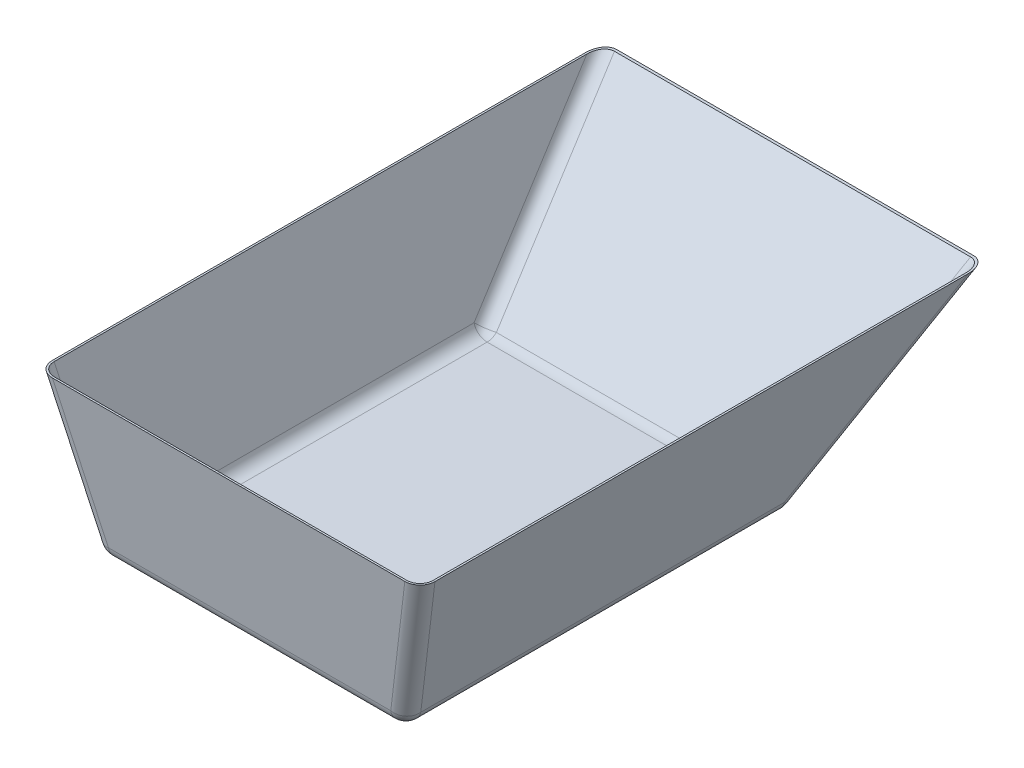
ISO-10303-21;
HEADER;
FILE_DESCRIPTION(('STEP AP214'),'2;1');
FILE_NAME('part.step','',(''),(''),'','','');
FILE_SCHEMA(('AUTOMOTIVE_DESIGN { 1 0 10303 214 1 1 1 1 }'));
ENDSEC;
DATA;
#1=APPLICATION_CONTEXT('core data for automotive mechanical design processes');
#2=APPLICATION_PROTOCOL_DEFINITION('international standard','automotive_design',2000,#1);
#3=PRODUCT_CONTEXT('',#1,'mechanical');
#4=PRODUCT('Part','Part','',(#3));
#5=PRODUCT_RELATED_PRODUCT_CATEGORY('part','',(#4));
#6=PRODUCT_DEFINITION_FORMATION('','',#4);
#7=PRODUCT_DEFINITION_CONTEXT('part definition',#1,'design');
#8=PRODUCT_DEFINITION('design','',#6,#7);
#9=PRODUCT_DEFINITION_SHAPE('','',#8);
#10=(LENGTH_UNIT() NAMED_UNIT(*) SI_UNIT(.MILLI.,.METRE.));
#11=(NAMED_UNIT(*) PLANE_ANGLE_UNIT() SI_UNIT($,.RADIAN.));
#12=(NAMED_UNIT(*) SI_UNIT($,.STERADIAN.) SOLID_ANGLE_UNIT());
#13=UNCERTAINTY_MEASURE_WITH_UNIT(LENGTH_MEASURE(1.E-05),#10,'distance_accuracy_value','');
#14=(GEOMETRIC_REPRESENTATION_CONTEXT(3) GLOBAL_UNCERTAINTY_ASSIGNED_CONTEXT((#13)) GLOBAL_UNIT_ASSIGNED_CONTEXT((#10,
#11,#12)) REPRESENTATION_CONTEXT('',''));
#15=CARTESIAN_POINT('',(0.,0.,0.));
#16=DIRECTION('',(0.,0.,1.));
#17=DIRECTION('',(1.,0.,0.));
#18=AXIS2_PLACEMENT_3D('',#15,#16,#17);
#19=CARTESIAN_POINT('',(-125.,50.,370.));
#20=DIRECTION('',(0.,-1.,0.));
#21=DIRECTION('',(0.,0.,-1.));
#22=AXIS2_PLACEMENT_3D('',#19,#20,#21);
#23=PLANE('',#22);
#24=DIRECTION('',(0.,0.,-1.));
#25=VECTOR('',#24,1.);
#26=CARTESIAN_POINT('',(125.,50.,370.));
#27=LINE('',#26,#25);
#28=CARTESIAN_POINT('',(125.,50.,360.251929229476));
#29=VERTEX_POINT('',#28);
#30=CARTESIAN_POINT('',(125.,50.,11.9533759371185));
#31=VERTEX_POINT('',#30);
#32=EDGE_CURVE('E244',#29,#31,#27,.T.);
#33=ORIENTED_EDGE('',*,*,#32,.T.);
#34=CARTESIAN_POINT('',(114.692235935956,50.,14.5));
#35=DIRECTION('',(0.,-1.,0.));
#36=DIRECTION('',(0.23162052730604,0.,-0.972806214685367));
#37=AXIS2_PLACEMENT_3D('',#34,#35,#36);
#38=ELLIPSE('',#37,14.7139389695622,10.);
#39=CARTESIAN_POINT('',(116.502580763542,50.,0.));
#40=VERTEX_POINT('',#39);
#41=EDGE_CURVE('E11',#31,#40,#38,.F.);
#42=ORIENTED_EDGE('',*,*,#41,.T.);
#43=DIRECTION('',(-1.,0.,0.));
#44=VECTOR('',#43,1.);
#45=CARTESIAN_POINT('',(-125.,50.,0.));
#46=LINE('',#45,#44);
#47=CARTESIAN_POINT('',(-116.502580763542,50.,0.));
#48=VERTEX_POINT('',#47);
#49=EDGE_CURVE('E239',#40,#48,#46,.T.);
#50=ORIENTED_EDGE('',*,*,#49,.T.);
#51=CARTESIAN_POINT('',(-114.692235935956,50.,14.5));
#52=DIRECTION('',(0.,-1.,0.));
#53=DIRECTION('',(0.23162052730604,0.,0.972806214685367));
#54=AXIS2_PLACEMENT_3D('',#51,#52,#53);
#55=ELLIPSE('',#54,14.7139389695622,10.);
#56=CARTESIAN_POINT('',(-125.,50.,11.9533759371185));
#57=VERTEX_POINT('',#56);
#58=EDGE_CURVE('E43',#48,#57,#55,.F.);
#59=ORIENTED_EDGE('',*,*,#58,.T.);
#60=DIRECTION('',(0.,0.,-1.));
#61=VECTOR('',#60,1.);
#62=CARTESIAN_POINT('',(-125.,50.,370.));
#63=LINE('',#62,#61);
#64=CARTESIAN_POINT('',(-125.,50.,360.251929229476));
#65=VERTEX_POINT('',#64);
#66=EDGE_CURVE('E238',#65,#57,#63,.T.);
#67=ORIENTED_EDGE('',*,*,#66,.F.);
#68=CARTESIAN_POINT('',(-114.692235935956,50.,359.888125791922));
#69=DIRECTION('',(0.,-1.,0.));
#70=DIRECTION('',(-0.857492925712544,0.,0.514495755427527));
#71=AXIS2_PLACEMENT_3D('',#68,#69,#70);
#72=ELLIPSE('',#71,10.4163333279998,10.);
#73=CARTESIAN_POINT('',(-115.063087068281,50.,370.));
#74=VERTEX_POINT('',#73);
#75=EDGE_CURVE('E282',#65,#74,#72,.F.);
#76=ORIENTED_EDGE('',*,*,#75,.T.);
#77=DIRECTION('',(-1.,0.,0.));
#78=VECTOR('',#77,1.);
#79=CARTESIAN_POINT('',(-125.,50.,370.));
#80=LINE('',#79,#78);
#81=CARTESIAN_POINT('',(115.063087068281,50.,370.));
#82=VERTEX_POINT('',#81);
#83=EDGE_CURVE('E235',#82,#74,#80,.T.);
#84=ORIENTED_EDGE('',*,*,#83,.F.);
#85=CARTESIAN_POINT('',(114.692235935956,50.,359.888125791922));
#86=DIRECTION('',(0.,-1.,0.));
#87=DIRECTION('',(-0.857492925712544,0.,-0.514495755427527));
#88=AXIS2_PLACEMENT_3D('',#85,#86,#87);
#89=ELLIPSE('',#88,10.4163333279998,10.);
#90=EDGE_CURVE('E280',#82,#29,#89,.F.);
#91=ORIENTED_EDGE('',*,*,#90,.T.);
#92=EDGE_LOOP('',(#33,#42,#50,#59,#67,#76,#84,#91));
#93=FACE_BOUND('',#92,.T.);
#94=DIRECTION('',(0.,0.,-1.));
#95=VECTOR('',#94,1.);
#96=CARTESIAN_POINT('',(123.763068312315,50.,370.));
#97=LINE('',#96,#95);
#98=CARTESIAN_POINT('',(123.763068312315,50.,360.20827281697));
#99=VERTEX_POINT('',#98);
#100=CARTESIAN_POINT('',(123.763068312315,50.,12.2589708246643));
#101=VERTEX_POINT('',#100);
#102=EDGE_CURVE('E213',#99,#101,#97,.T.);
#103=ORIENTED_EDGE('',*,*,#102,.F.);
#104=CARTESIAN_POINT('',(114.692235935956,50.,359.888125791922));
#105=DIRECTION('',(0.,-1.,0.));
#106=DIRECTION('',(-0.857492925712544,0.,-0.514495755427527));
#107=AXIS2_PLACEMENT_3D('',#104,#105,#106);
#108=ELLIPSE('',#107,9.16637332863985,8.8);
#109=CARTESIAN_POINT('',(115.018584932402,50.,368.786575095031));
#110=VERTEX_POINT('',#109);
#111=EDGE_CURVE('E231',#110,#99,#108,.F.);
#112=ORIENTED_EDGE('',*,*,#111,.F.);
#113=DIRECTION('',(-1.,0.,0.));
#114=VECTOR('',#113,1.);
#115=CARTESIAN_POINT('',(125.,50.,368.786575095031));
#116=LINE('',#115,#114);
#117=CARTESIAN_POINT('',(-115.018584932402,50.,368.786575095031));
#118=VERTEX_POINT('',#117);
#119=EDGE_CURVE('E51',#110,#118,#116,.T.);
#120=ORIENTED_EDGE('',*,*,#119,.T.);
#121=CARTESIAN_POINT('',(-114.692235935956,50.,359.888125791922));
#122=DIRECTION('',(0.,-1.,0.));
#123=DIRECTION('',(-0.857492925712544,0.,0.514495755427527));
#124=AXIS2_PLACEMENT_3D('',#121,#122,#123);
#125=ELLIPSE('',#124,9.16637332863985,8.8);
#126=CARTESIAN_POINT('',(-123.763068312315,50.,360.20827281697));
#127=VERTEX_POINT('',#126);
#128=EDGE_CURVE('E227',#127,#118,#125,.F.);
#129=ORIENTED_EDGE('',*,*,#128,.F.);
#130=DIRECTION('',(0.,0.,-1.));
#131=VECTOR('',#130,1.);
#132=CARTESIAN_POINT('',(-123.763068312315,50.,0.));
#133=LINE('',#132,#131);
#134=CARTESIAN_POINT('',(-123.763068312315,50.,12.2589708246643));
#135=VERTEX_POINT('',#134);
#136=EDGE_CURVE('E217',#127,#135,#133,.T.);
#137=ORIENTED_EDGE('',*,*,#136,.T.);
#138=CARTESIAN_POINT('',(-114.692235935956,50.,14.5));
#139=DIRECTION('',(0.,-1.,0.));
#140=DIRECTION('',(0.23162052730604,0.,0.972806214685367));
#141=AXIS2_PLACEMENT_3D('',#138,#139,#140);
#142=ELLIPSE('',#141,12.9482662932147,8.8);
#143=CARTESIAN_POINT('',(-116.285339384232,50.,1.73999999999999));
#144=VERTEX_POINT('',#143);
#145=EDGE_CURVE('E221',#144,#135,#142,.F.);
#146=ORIENTED_EDGE('',*,*,#145,.F.);
#147=DIRECTION('',(-1.,0.,0.));
#148=VECTOR('',#147,1.);
#149=CARTESIAN_POINT('',(-125.,50.,1.74000000000002));
#150=LINE('',#149,#148);
#151=CARTESIAN_POINT('',(116.285339384232,50.,1.73999999999998));
#152=VERTEX_POINT('',#151);
#153=EDGE_CURVE('E222',#152,#144,#150,.T.);
#154=ORIENTED_EDGE('',*,*,#153,.F.);
#155=CARTESIAN_POINT('',(114.692235935956,50.,14.5));
#156=DIRECTION('',(0.,-1.,0.));
#157=DIRECTION('',(0.23162052730604,0.,-0.972806214685367));
#158=AXIS2_PLACEMENT_3D('',#155,#156,#157);
#159=ELLIPSE('',#158,12.9482662932147,8.8);
#160=EDGE_CURVE('E218',#101,#152,#159,.F.);
#161=ORIENTED_EDGE('',*,*,#160,.F.);
#162=EDGE_LOOP('',(#103,#112,#120,#129,#137,#146,#154,#161));
#163=FACE_BOUND('',#162,.T.);
#164=ADVANCED_FACE('F34',(#93,#163),#23,.F.);
#165=CARTESIAN_POINT('',(-125.,-50.,370.));
#166=DIRECTION('',(0.,1.,0.));
#167=DIRECTION('',(0.,0.,1.));
#168=AXIS2_PLACEMENT_3D('',#165,#166,#167);
#169=PLANE('',#168);
#170=DIRECTION('',(-1.,0.,0.));
#171=VECTOR('',#170,1.);
#172=CARTESIAN_POINT('',(-125.,-50.,346.388125791922));
#173=LINE('',#172,#171);
#174=CARTESIAN_POINT('',(92.1922359359558,-50.,346.388125791922));
#175=VERTEX_POINT('',#174);
#176=CARTESIAN_POINT('',(-92.1922359359558,-50.,346.388125791922));
#177=VERTEX_POINT('',#176);
#178=EDGE_CURVE('E258',#175,#177,#173,.T.);
#179=ORIENTED_EDGE('',*,*,#178,.T.);
#180=DIRECTION('',(0.,0.,1.));
#181=VECTOR('',#180,1.);
#182=CARTESIAN_POINT('',(-92.1922359359558,-50.,370.));
#183=LINE('',#182,#181);
#184=CARTESIAN_POINT('',(-92.1922359359558,-50.,109.));
#185=VERTEX_POINT('',#184);
#186=EDGE_CURVE('E260',#177,#185,#183,.F.);
#187=ORIENTED_EDGE('',*,*,#186,.T.);
#188=DIRECTION('',(-1.,0.,0.));
#189=VECTOR('',#188,1.);
#190=CARTESIAN_POINT('',(-125.,-50.,109.));
#191=LINE('',#190,#189);
#192=CARTESIAN_POINT('',(92.1922359359558,-50.,109.));
#193=VERTEX_POINT('',#192);
#194=EDGE_CURVE('E254',#185,#193,#191,.F.);
#195=ORIENTED_EDGE('',*,*,#194,.T.);
#196=DIRECTION('',(0.,0.,1.));
#197=VECTOR('',#196,1.);
#198=CARTESIAN_POINT('',(92.1922359359558,-50.,370.));
#199=LINE('',#198,#197);
#200=EDGE_CURVE('E256',#193,#175,#199,.T.);
#201=ORIENTED_EDGE('',*,*,#200,.T.);
#202=EDGE_LOOP('',(#179,#187,#195,#201));
#203=FACE_BOUND('',#202,.T.);
#204=ADVANCED_FACE('F366',(#203),#169,.F.);
#205=CARTESIAN_POINT('',(-125.,50.,0.));
#206=DIRECTION('',(0.970142500145332,0.242535625036333,0.));
#207=DIRECTION('',(-0.242535625036333,0.970142500145332,0.));
#208=AXIS2_PLACEMENT_3D('',#205,#206,#207);
#209=PLANE('',#208);
#210=ORIENTED_EDGE('',*,*,#66,.T.);
#211=DIRECTION('',(0.169906916507646,-0.679627666030585,0.713609049332114));
#212=VECTOR('',#211,1.);
#213=CARTESIAN_POINT('',(-126.449312324939,55.7972492997572,5.86626417237341));
#214=LINE('',#213,#212);
#215=CARTESIAN_POINT('',(-101.893660937409,-42.4253562503633,109.));
#216=VERTEX_POINT('',#215);
#217=EDGE_CURVE('E252',#57,#216,#214,.T.);
#218=ORIENTED_EDGE('',*,*,#217,.T.);
#219=DIRECTION('',(0.,0.,1.));
#220=VECTOR('',#219,1.);
#221=CARTESIAN_POINT('',(-101.893660937409,-42.4253562503633,0.));
#222=LINE('',#221,#220);
#223=CARTESIAN_POINT('',(-101.893660937409,-42.4253562503633,346.388125791922));
#224=VERTEX_POINT('',#223);
#225=EDGE_CURVE('E249',#216,#224,#222,.T.);
#226=ORIENTED_EDGE('',*,*,#225,.T.);
#227=DIRECTION('',(-0.24000768036866,0.960030721474639,0.144004608221196));
#228=VECTOR('',#227,1.);
#229=CARTESIAN_POINT('',(-112.548896455202,0.19558582080971,352.781267102598));
#230=LINE('',#229,#228);
#231=EDGE_CURVE('E247',#224,#65,#230,.T.);
#232=ORIENTED_EDGE('',*,*,#231,.T.);
#233=EDGE_LOOP('',(#210,#218,#226,#232));
#234=FACE_BOUND('',#233,.T.);
#235=ADVANCED_FACE('F339',(#234),#209,.F.);
#236=CARTESIAN_POINT('',(100.,-50.,0.));
#237=DIRECTION('',(-0.970142500145332,0.242535625036333,0.));
#238=DIRECTION('',(-0.242535625036333,-0.970142500145332,0.));
#239=AXIS2_PLACEMENT_3D('',#236,#237,#238);
#240=PLANE('',#239);
#241=DIRECTION('',(0.,0.,1.));
#242=VECTOR('',#241,1.);
#243=CARTESIAN_POINT('',(101.893660937409,-42.4253562503633,0.));
#244=LINE('',#243,#242);
#245=CARTESIAN_POINT('',(101.893660937409,-42.4253562503633,346.388125791922));
#246=VERTEX_POINT('',#245);
#247=CARTESIAN_POINT('',(101.893660937409,-42.4253562503633,109.));
#248=VERTEX_POINT('',#247);
#249=EDGE_CURVE('E271',#246,#248,#244,.F.);
#250=ORIENTED_EDGE('',*,*,#249,.T.);
#251=DIRECTION('',(0.169906916507646,0.679627666030585,-0.713609049332114));
#252=VECTOR('',#251,1.);
#253=CARTESIAN_POINT('',(114.180259207156,6.72103682862558,57.3962872670616));
#254=LINE('',#253,#252);
#255=EDGE_CURVE('E273',#248,#31,#254,.T.);
#256=ORIENTED_EDGE('',*,*,#255,.T.);
#257=ORIENTED_EDGE('',*,*,#32,.F.);
#258=DIRECTION('',(-0.24000768036866,-0.960030721474639,-0.144004608221196));
#259=VECTOR('',#258,1.);
#260=CARTESIAN_POINT('',(88.0673296349259,-97.7306814602963,338.092327010432));
#261=LINE('',#260,#259);
#262=EDGE_CURVE('E269',#29,#246,#261,.T.);
#263=ORIENTED_EDGE('',*,*,#262,.T.);
#264=EDGE_LOOP('',(#250,#256,#257,#263));
#265=FACE_BOUND('',#264,.T.);
#266=ADVANCED_FACE('F370',(#265),#240,.F.);
#267=CARTESIAN_POINT('',(125.,50.,370.));
#268=DIRECTION('',(0.,0.148340452930245,-0.988936352868298));
#269=DIRECTION('',(0.,0.988936352868298,0.148340452930245));
#270=AXIS2_PLACEMENT_3D('',#267,#268,#269);
#271=PLANE('',#270);
#272=ORIENTED_EDGE('',*,*,#83,.T.);
#273=DIRECTION('',(-0.24000768036866,0.960030721474639,0.144004608221196));
#274=VECTOR('',#273,1.);
#275=CARTESIAN_POINT('',(-101.234568227943,-5.31407536135515,361.702888695797));
#276=LINE('',#275,#274);
#277=CARTESIAN_POINT('',(-92.1922359359558,-41.4834045293024,356.277489320605));
#278=VERTEX_POINT('',#277);
#279=EDGE_CURVE('E267',#74,#278,#276,.F.);
#280=ORIENTED_EDGE('',*,*,#279,.T.);
#281=DIRECTION('',(-1.,0.,0.));
#282=VECTOR('',#281,1.);
#283=CARTESIAN_POINT('',(125.,-41.4834045293025,356.277489320605));
#284=LINE('',#283,#282);
#285=CARTESIAN_POINT('',(92.1922359359558,-41.4834045293024,356.277489320605));
#286=VERTEX_POINT('',#285);
#287=EDGE_CURVE('E265',#278,#286,#284,.F.);
#288=ORIENTED_EDGE('',*,*,#287,.T.);
#289=DIRECTION('',(-0.24000768036866,-0.960030721474639,-0.144004608221196));
#290=VECTOR('',#289,1.);
#291=CARTESIAN_POINT('',(115.635489886929,52.2896112745895,370.343441691188));
#292=LINE('',#291,#290);
#293=EDGE_CURVE('E263',#286,#82,#292,.F.);
#294=ORIENTED_EDGE('',*,*,#293,.T.);
#295=EDGE_LOOP('',(#272,#280,#288,#294));
#296=FACE_BOUND('',#295,.T.);
#297=ADVANCED_FACE('F349',(#296),#271,.F.);
#298=CARTESIAN_POINT('',(125.,50.,0.));
#299=DIRECTION('',(0.,0.724137931034483,0.689655172413793));
#300=DIRECTION('',(0.,-0.689655172413793,0.724137931034483));
#301=AXIS2_PLACEMENT_3D('',#298,#299,#300);
#302=PLANE('',#301);
#303=ORIENTED_EDGE('',*,*,#49,.F.);
#304=DIRECTION('',(0.169906916507646,0.679627666030585,-0.713609049332114));
#305=VECTOR('',#304,1.);
#306=CARTESIAN_POINT('',(116.747887323486,50.9812262397757,-1.03028755176453));
#307=LINE('',#306,#305);
#308=CARTESIAN_POINT('',(92.1922359359558,-47.2413793103448,102.103448275862));
#309=VERTEX_POINT('',#308);
#310=EDGE_CURVE('E59',#40,#309,#307,.F.);
#311=ORIENTED_EDGE('',*,*,#310,.T.);
#312=DIRECTION('',(-1.,0.,0.));
#313=VECTOR('',#312,1.);
#314=CARTESIAN_POINT('',(125.,-47.2413793103448,102.103448275862));
#315=LINE('',#314,#313);
#316=CARTESIAN_POINT('',(-92.1922359359558,-47.2413793103448,102.103448275862));
#317=VERTEX_POINT('',#316);
#318=EDGE_CURVE('E277',#309,#317,#315,.T.);
#319=ORIENTED_EDGE('',*,*,#318,.T.);
#320=DIRECTION('',(0.169906916507646,-0.679627666030585,0.713609049332114));
#321=VECTOR('',#320,1.);
#322=CARTESIAN_POINT('',(-109.530797254202,22.1128659626395,29.2814907392285));
#323=LINE('',#322,#321);
#324=EDGE_CURVE('E275',#317,#48,#323,.F.);
#325=ORIENTED_EDGE('',*,*,#324,.T.);
#326=EDGE_LOOP('',(#303,#311,#319,#325));
#327=FACE_BOUND('',#326,.T.);
#328=ADVANCED_FACE('F327',(#327),#302,.F.);
#329=CARTESIAN_POINT('',(104.478834205703,9.14639307898891,57.3962872670616));
#330=DIRECTION('',(0.169906916507646,0.679627666030585,-0.713609049332114));
#331=DIRECTION('',(0.,0.724137931034483,0.689655172413793));
#332=AXIS2_PLACEMENT_3D('',#329,#330,#331);
#333=CYLINDRICAL_SURFACE('',#332,10.);
#334=ORIENTED_EDGE('',*,*,#41,.F.);
#335=ORIENTED_EDGE('',*,*,#255,.F.);
#336=CARTESIAN_POINT('',(92.1922359359558,-40.,109.));
#337=DIRECTION('',(-0.169906916507646,-0.679627666030585,0.713609049332114));
#338=DIRECTION('',(0.,-0.724137931034483,-0.689655172413793));
#339=AXIS2_PLACEMENT_3D('',#336,#337,#338);
#340=CIRCLE('',#339,10.);
#341=EDGE_CURVE('E311',#309,#248,#340,.T.);
#342=ORIENTED_EDGE('',*,*,#341,.F.);
#343=ORIENTED_EDGE('',*,*,#310,.F.);
#344=EDGE_LOOP('',(#334,#335,#342,#343));
#345=FACE_BOUND('',#344,.T.);
#346=ADVANCED_FACE('F36',(#345),#333,.T.);
#347=CARTESIAN_POINT('',(78.3659046334726,-95.3053252099329,338.092327010432));
#348=DIRECTION('',(-0.24000768036866,-0.960030721474639,-0.144004608221196));
#349=DIRECTION('',(0.970142500145332,-0.242535625036333,0.));
#350=AXIS2_PLACEMENT_3D('',#347,#348,#349);
#351=CYLINDRICAL_SURFACE('',#350,10.);
#352=ORIENTED_EDGE('',*,*,#90,.F.);
#353=ORIENTED_EDGE('',*,*,#293,.F.);
#354=CARTESIAN_POINT('',(92.1922359359558,-40.,346.388125791922));
#355=DIRECTION('',(-0.24000768036866,-0.960030721474639,-0.144004608221196));
#356=DIRECTION('',(0.970142500145332,-0.242535625036333,0.));
#357=AXIS2_PLACEMENT_3D('',#354,#355,#356);
#358=CIRCLE('',#357,10.);
#359=EDGE_CURVE('E309',#246,#286,#358,.T.);
#360=ORIENTED_EDGE('',*,*,#359,.F.);
#361=ORIENTED_EDGE('',*,*,#262,.F.);
#362=EDGE_LOOP('',(#352,#353,#360,#361));
#363=FACE_BOUND('',#362,.T.);
#364=ADVANCED_FACE('F354',(#363),#351,.T.);
#365=CARTESIAN_POINT('',(92.1922359359558,-40.,370.));
#366=DIRECTION('',(0.,0.,1.));
#367=DIRECTION('',(1.,0.,0.));
#368=AXIS2_PLACEMENT_3D('',#365,#366,#367);
#369=CYLINDRICAL_SURFACE('',#368,10.);
#370=CARTESIAN_POINT('',(92.1922359359558,-40.,109.));
#371=DIRECTION('',(0.,0.,-1.));
#372=DIRECTION('',(0.,1.,0.));
#373=AXIS2_PLACEMENT_3D('',#370,#371,#372);
#374=CIRCLE('',#373,10.);
#375=EDGE_CURVE('E38',#248,#193,#374,.T.);
#376=ORIENTED_EDGE('',*,*,#375,.F.);
#377=ORIENTED_EDGE('',*,*,#249,.F.);
#378=CARTESIAN_POINT('',(92.1922359359558,-40.,346.388125791922));
#379=DIRECTION('',(0.,0.,1.));
#380=DIRECTION('',(1.,0.,0.));
#381=AXIS2_PLACEMENT_3D('',#378,#379,#380);
#382=CIRCLE('',#381,10.);
#383=EDGE_CURVE('E306',#175,#246,#382,.T.);
#384=ORIENTED_EDGE('',*,*,#383,.F.);
#385=ORIENTED_EDGE('',*,*,#200,.F.);
#386=EDGE_LOOP('',(#376,#377,#384,#385));
#387=FACE_BOUND('',#386,.T.);
#388=ADVANCED_FACE('F367',(#387),#369,.T.);
#389=CARTESIAN_POINT('',(92.1922359359558,-40.,109.));
#390=DIRECTION('',(0.,0.,1.));
#391=DIRECTION('',(1.,0.,0.));
#392=AXIS2_PLACEMENT_3D('',#389,#390,#391);
#393=SPHERICAL_SURFACE('',#392,10.);
#394=ORIENTED_EDGE('',*,*,#341,.T.);
#395=ORIENTED_EDGE('',*,*,#375,.T.);
#396=CARTESIAN_POINT('',(92.1922359359558,-40.,109.));
#397=DIRECTION('',(1.,0.,0.));
#398=DIRECTION('',(0.,0.,-1.));
#399=AXIS2_PLACEMENT_3D('',#396,#397,#398);
#400=CIRCLE('',#399,10.);
#401=EDGE_CURVE('E303',#309,#193,#400,.F.);
#402=ORIENTED_EDGE('',*,*,#401,.F.);
#403=EDGE_LOOP('',(#394,#395,#402));
#404=FACE_BOUND('',#403,.T.);
#405=ADVANCED_FACE('F317',(#404),#393,.T.);
#406=CARTESIAN_POINT('',(92.1922359359558,-40.,346.388125791922));
#407=DIRECTION('',(0.,0.,1.));
#408=DIRECTION('',(1.,0.,0.));
#409=AXIS2_PLACEMENT_3D('',#406,#407,#408);
#410=SPHERICAL_SURFACE('',#409,10.);
#411=ORIENTED_EDGE('',*,*,#383,.T.);
#412=ORIENTED_EDGE('',*,*,#359,.T.);
#413=CARTESIAN_POINT('',(92.1922359359558,-40.,346.388125791922));
#414=DIRECTION('',(1.,0.,0.));
#415=DIRECTION('',(0.,0.,-1.));
#416=AXIS2_PLACEMENT_3D('',#413,#414,#415);
#417=CIRCLE('',#416,10.);
#418=EDGE_CURVE('E300',#175,#286,#417,.F.);
#419=ORIENTED_EDGE('',*,*,#418,.F.);
#420=EDGE_LOOP('',(#411,#412,#419));
#421=FACE_BOUND('',#420,.T.);
#422=ADVANCED_FACE('F358',(#421),#410,.T.);
#423=CARTESIAN_POINT('',(125.,-40.,109.));
#424=DIRECTION('',(-1.,0.,0.));
#425=DIRECTION('',(0.,0.,1.));
#426=AXIS2_PLACEMENT_3D('',#423,#424,#425);
#427=CYLINDRICAL_SURFACE('',#426,10.);
#428=ORIENTED_EDGE('',*,*,#401,.T.);
#429=ORIENTED_EDGE('',*,*,#194,.F.);
#430=CARTESIAN_POINT('',(-92.1922359359558,-40.,109.));
#431=DIRECTION('',(-1.,0.,0.));
#432=DIRECTION('',(0.,0.,1.));
#433=AXIS2_PLACEMENT_3D('',#430,#431,#432);
#434=CIRCLE('',#433,10.);
#435=EDGE_CURVE('E297',#317,#185,#434,.T.);
#436=ORIENTED_EDGE('',*,*,#435,.F.);
#437=ORIENTED_EDGE('',*,*,#318,.F.);
#438=EDGE_LOOP('',(#428,#429,#436,#437));
#439=FACE_BOUND('',#438,.T.);
#440=ADVANCED_FACE('F324',(#439),#427,.T.);
#441=CARTESIAN_POINT('',(-116.747887323486,58.2226055501206,5.8662641723734));
#442=DIRECTION('',(0.169906916507646,-0.679627666030585,0.713609049332114));
#443=DIRECTION('',(0.,-0.724137931034483,-0.689655172413793));
#444=AXIS2_PLACEMENT_3D('',#441,#442,#443);
#445=CYLINDRICAL_SURFACE('',#444,10.);
#446=ORIENTED_EDGE('',*,*,#58,.F.);
#447=ORIENTED_EDGE('',*,*,#324,.F.);
#448=CARTESIAN_POINT('',(-92.1922359359558,-40.,109.));
#449=DIRECTION('',(0.169906916507646,-0.679627666030586,0.713609049332113));
#450=DIRECTION('',(0.,-0.724137931034482,-0.689655172413794));
#451=AXIS2_PLACEMENT_3D('',#448,#449,#450);
#452=CIRCLE('',#451,10.);
#453=EDGE_CURVE('E294',#216,#317,#452,.T.);
#454=ORIENTED_EDGE('',*,*,#453,.F.);
#455=ORIENTED_EDGE('',*,*,#217,.F.);
#456=EDGE_LOOP('',(#446,#447,#454,#455));
#457=FACE_BOUND('',#456,.T.);
#458=ADVANCED_FACE('F331',(#457),#445,.T.);
#459=CARTESIAN_POINT('',(-102.847471453749,2.62094207117303,352.781267102598));
#460=DIRECTION('',(-0.24000768036866,0.960030721474639,0.144004608221196));
#461=DIRECTION('',(-0.970142500145332,-0.242535625036333,0.));
#462=AXIS2_PLACEMENT_3D('',#459,#460,#461);
#463=CYLINDRICAL_SURFACE('',#462,10.);
#464=ORIENTED_EDGE('',*,*,#75,.F.);
#465=ORIENTED_EDGE('',*,*,#231,.F.);
#466=CARTESIAN_POINT('',(-92.1922359359558,-40.,346.388125791922));
#467=DIRECTION('',(0.24000768036866,-0.960030721474638,-0.144004608221196));
#468=DIRECTION('',(0.970142500145332,0.242535625036334,0.));
#469=AXIS2_PLACEMENT_3D('',#466,#467,#468);
#470=CIRCLE('',#469,10.);
#471=EDGE_CURVE('E291',#278,#224,#470,.T.);
#472=ORIENTED_EDGE('',*,*,#471,.F.);
#473=ORIENTED_EDGE('',*,*,#279,.F.);
#474=EDGE_LOOP('',(#464,#465,#472,#473));
#475=FACE_BOUND('',#474,.T.);
#476=ADVANCED_FACE('F344',(#475),#463,.T.);
#477=CARTESIAN_POINT('',(-125.,-40.,346.388125791922));
#478=DIRECTION('',(-1.,0.,0.));
#479=DIRECTION('',(0.,0.,1.));
#480=AXIS2_PLACEMENT_3D('',#477,#478,#479);
#481=CYLINDRICAL_SURFACE('',#480,10.);
#482=ORIENTED_EDGE('',*,*,#418,.T.);
#483=ORIENTED_EDGE('',*,*,#287,.F.);
#484=CARTESIAN_POINT('',(-92.1922359359558,-40.,346.388125791922));
#485=DIRECTION('',(-1.,0.,0.));
#486=DIRECTION('',(0.,0.,1.));
#487=AXIS2_PLACEMENT_3D('',#484,#485,#486);
#488=CIRCLE('',#487,10.);
#489=EDGE_CURVE('E288',#177,#278,#488,.T.);
#490=ORIENTED_EDGE('',*,*,#489,.F.);
#491=ORIENTED_EDGE('',*,*,#178,.F.);
#492=EDGE_LOOP('',(#482,#483,#490,#491));
#493=FACE_BOUND('',#492,.T.);
#494=ADVANCED_FACE('F362',(#493),#481,.T.);
#495=CARTESIAN_POINT('',(-92.1922359359558,-40.,109.));
#496=DIRECTION('',(0.,0.,1.));
#497=DIRECTION('',(1.,0.,0.));
#498=AXIS2_PLACEMENT_3D('',#495,#496,#497);
#499=SPHERICAL_SURFACE('',#498,10.);
#500=ORIENTED_EDGE('',*,*,#453,.T.);
#501=ORIENTED_EDGE('',*,*,#435,.T.);
#502=CARTESIAN_POINT('',(-92.1922359359558,-40.,109.));
#503=DIRECTION('',(0.,0.,-1.));
#504=DIRECTION('',(-1.,0.,0.));
#505=AXIS2_PLACEMENT_3D('',#502,#503,#504);
#506=CIRCLE('',#505,10.);
#507=EDGE_CURVE('E286',#216,#185,#506,.F.);
#508=ORIENTED_EDGE('',*,*,#507,.F.);
#509=EDGE_LOOP('',(#500,#501,#508));
#510=FACE_BOUND('',#509,.T.);
#511=ADVANCED_FACE('F396',(#510),#499,.T.);
#512=CARTESIAN_POINT('',(-92.1922359359558,-40.,346.388125791922));
#513=DIRECTION('',(0.,0.,1.));
#514=DIRECTION('',(1.,0.,0.));
#515=AXIS2_PLACEMENT_3D('',#512,#513,#514);
#516=SPHERICAL_SURFACE('',#515,10.);
#517=ORIENTED_EDGE('',*,*,#489,.T.);
#518=ORIENTED_EDGE('',*,*,#471,.T.);
#519=CARTESIAN_POINT('',(-92.1922359359558,-40.,346.388125791922));
#520=DIRECTION('',(0.,0.,1.));
#521=DIRECTION('',(0.,-1.,0.));
#522=AXIS2_PLACEMENT_3D('',#519,#520,#521);
#523=CIRCLE('',#522,10.);
#524=EDGE_CURVE('E220',#177,#224,#523,.F.);
#525=ORIENTED_EDGE('',*,*,#524,.F.);
#526=EDGE_LOOP('',(#517,#518,#525));
#527=FACE_BOUND('',#526,.T.);
#528=ADVANCED_FACE('F392',(#527),#516,.T.);
#529=CARTESIAN_POINT('',(-92.1922359359558,-40.,0.));
#530=DIRECTION('',(0.,0.,1.));
#531=DIRECTION('',(1.,0.,0.));
#532=AXIS2_PLACEMENT_3D('',#529,#530,#531);
#533=CYLINDRICAL_SURFACE('',#532,10.);
#534=ORIENTED_EDGE('',*,*,#507,.T.);
#535=ORIENTED_EDGE('',*,*,#186,.F.);
#536=ORIENTED_EDGE('',*,*,#524,.T.);
#537=ORIENTED_EDGE('',*,*,#225,.F.);
#538=EDGE_LOOP('',(#534,#535,#536,#537));
#539=FACE_BOUND('',#538,.T.);
#540=ADVANCED_FACE('F389',(#539),#533,.T.);
#541=CARTESIAN_POINT('',(-125.,-48.8,370.));
#542=DIRECTION('',(0.,1.,0.));
#543=DIRECTION('',(0.,0.,1.));
#544=AXIS2_PLACEMENT_3D('',#541,#542,#543);
#545=PLANE('',#544);
#546=DIRECTION('',(1.,0.,0.));
#547=VECTOR('',#546,1.);
#548=CARTESIAN_POINT('',(-125.,-48.8,346.388125791922));
#549=LINE('',#548,#547);
#550=CARTESIAN_POINT('',(92.1922359359558,-48.8,346.388125791922));
#551=VERTEX_POINT('',#550);
#552=CARTESIAN_POINT('',(-92.1922359359558,-48.8,346.388125791922));
#553=VERTEX_POINT('',#552);
#554=EDGE_CURVE('E176',#551,#553,#549,.F.);
#555=ORIENTED_EDGE('',*,*,#554,.F.);
#556=DIRECTION('',(0.,0.,1.));
#557=VECTOR('',#556,1.);
#558=CARTESIAN_POINT('',(92.1922359359558,-48.8,370.));
#559=LINE('',#558,#557);
#560=CARTESIAN_POINT('',(92.1922359359558,-48.8,109.));
#561=VERTEX_POINT('',#560);
#562=EDGE_CURVE('E186',#561,#551,#559,.T.);
#563=ORIENTED_EDGE('',*,*,#562,.F.);
#564=DIRECTION('',(1.,0.,0.));
#565=VECTOR('',#564,1.);
#566=CARTESIAN_POINT('',(-125.,-48.8,109.));
#567=LINE('',#566,#565);
#568=CARTESIAN_POINT('',(-92.1922359359558,-48.8,109.));
#569=VERTEX_POINT('',#568);
#570=EDGE_CURVE('E200',#569,#561,#567,.T.);
#571=ORIENTED_EDGE('',*,*,#570,.F.);
#572=DIRECTION('',(0.,0.,1.));
#573=VECTOR('',#572,1.);
#574=CARTESIAN_POINT('',(-92.1922359359558,-48.8,370.));
#575=LINE('',#574,#573);
#576=EDGE_CURVE('E185',#553,#569,#575,.F.);
#577=ORIENTED_EDGE('',*,*,#576,.F.);
#578=EDGE_LOOP('',(#555,#563,#571,#577));
#579=FACE_BOUND('',#578,.T.);
#580=ADVANCED_FACE('F199',(#579),#545,.T.);
#581=CARTESIAN_POINT('',(-123.835828999826,50.2910427500436,0.));
#582=DIRECTION('',(0.970142500145332,0.242535625036333,0.));
#583=DIRECTION('',(-0.242535625036333,0.970142500145332,0.));
#584=AXIS2_PLACEMENT_3D('',#581,#582,#583);
#585=PLANE('',#584);
#586=ORIENTED_EDGE('',*,*,#136,.F.);
#587=DIRECTION('',(-0.24000768036866,0.960030721474639,0.144004608221196));
#588=VECTOR('',#587,1.);
#589=CARTESIAN_POINT('',(-111.384725455028,0.486628570853309,352.781267102598));
#590=LINE('',#589,#588);
#591=CARTESIAN_POINT('',(-100.729489937235,-42.1343135003197,346.388125791922));
#592=VERTEX_POINT('',#591);
#593=EDGE_CURVE('E216',#592,#127,#590,.T.);
#594=ORIENTED_EDGE('',*,*,#593,.F.);
#595=DIRECTION('',(0.,0.,1.));
#596=VECTOR('',#595,1.);
#597=CARTESIAN_POINT('',(-100.729489937235,-42.1343135003197,0.));
#598=LINE('',#597,#596);
#599=CARTESIAN_POINT('',(-100.729489937235,-42.1343135003197,109.));
#600=VERTEX_POINT('',#599);
#601=EDGE_CURVE('E208',#600,#592,#598,.T.);
#602=ORIENTED_EDGE('',*,*,#601,.F.);
#603=DIRECTION('',(0.169906916507646,-0.679627666030585,0.713609049332114));
#604=VECTOR('',#603,1.);
#605=CARTESIAN_POINT('',(-125.285141324765,56.0882920498008,5.86626417237341));
#606=LINE('',#605,#604);
#607=EDGE_CURVE('E693',#135,#600,#606,.T.);
#608=ORIENTED_EDGE('',*,*,#607,.F.);
#609=EDGE_LOOP('',(#586,#594,#602,#608));
#610=FACE_BOUND('',#609,.T.);
#611=ADVANCED_FACE('F460',(#610),#585,.T.);
#612=CARTESIAN_POINT('',(98.8358289998256,-49.7089572499564,0.));
#613=DIRECTION('',(-0.970142500145332,0.242535625036333,0.));
#614=DIRECTION('',(-0.242535625036333,-0.970142500145332,0.));
#615=AXIS2_PLACEMENT_3D('',#612,#613,#614);
#616=PLANE('',#615);
#617=DIRECTION('',(0.,0.,1.));
#618=VECTOR('',#617,1.);
#619=CARTESIAN_POINT('',(100.729489937235,-42.1343135003197,0.));
#620=LINE('',#619,#618);
#621=CARTESIAN_POINT('',(100.729489937235,-42.1343135003197,346.388125791922));
#622=VERTEX_POINT('',#621);
#623=CARTESIAN_POINT('',(100.729489937235,-42.1343135003197,109.));
#624=VERTEX_POINT('',#623);
#625=EDGE_CURVE('E725',#622,#624,#620,.F.);
#626=ORIENTED_EDGE('',*,*,#625,.F.);
#627=DIRECTION('',(-0.24000768036866,-0.960030721474639,-0.144004608221196));
#628=VECTOR('',#627,1.);
#629=CARTESIAN_POINT('',(86.9031586347515,-97.4396387102527,338.092327010432));
#630=LINE('',#629,#628);
#631=EDGE_CURVE('E701',#99,#622,#630,.T.);
#632=ORIENTED_EDGE('',*,*,#631,.F.);
#633=ORIENTED_EDGE('',*,*,#102,.T.);
#634=DIRECTION('',(0.169906916507646,0.679627666030585,-0.713609049332114));
#635=VECTOR('',#634,1.);
#636=CARTESIAN_POINT('',(113.016088206982,7.01207957866918,57.3962872670616));
#637=LINE('',#636,#635);
#638=EDGE_CURVE('E719',#624,#101,#637,.T.);
#639=ORIENTED_EDGE('',*,*,#638,.F.);
#640=EDGE_LOOP('',(#626,#632,#633,#639));
#641=FACE_BOUND('',#640,.T.);
#642=ADVANCED_FACE('F467',(#641),#616,.T.);
#643=CARTESIAN_POINT('',(125.,50.1780085435163,368.813276376558));
#644=DIRECTION('',(0.,0.148340452930245,-0.988936352868298));
#645=DIRECTION('',(0.,0.988936352868298,0.148340452930245));
#646=AXIS2_PLACEMENT_3D('',#643,#644,#645);
#647=PLANE('',#646);
#648=ORIENTED_EDGE('',*,*,#119,.F.);
#649=DIRECTION('',(-0.24000768036866,-0.960030721474639,-0.144004608221196));
#650=VECTOR('',#649,1.);
#651=CARTESIAN_POINT('',(78.3659046334726,-96.6107211957191,346.794966915673));
#652=LINE('',#651,#650);
#653=CARTESIAN_POINT('',(92.1922359359558,-41.3053959857862,355.090765697163));
#654=VERTEX_POINT('',#653);
#655=EDGE_CURVE('E203',#654,#110,#652,.F.);
#656=ORIENTED_EDGE('',*,*,#655,.F.);
#657=DIRECTION('',(1.,0.,0.));
#658=VECTOR('',#657,1.);
#659=CARTESIAN_POINT('',(125.,-41.3053959857862,355.090765697163));
#660=LINE('',#659,#658);
#661=CARTESIAN_POINT('',(-92.1922359359558,-41.3053959857862,355.090765697163));
#662=VERTEX_POINT('',#661);
#663=EDGE_CURVE('E702',#662,#654,#660,.T.);
#664=ORIENTED_EDGE('',*,*,#663,.F.);
#665=DIRECTION('',(-0.24000768036866,0.960030721474639,0.144004608221196));
#666=VECTOR('',#665,1.);
#667=CARTESIAN_POINT('',(-102.847471453749,1.31554608538688,361.483907007839));
#668=LINE('',#667,#666);
#669=EDGE_CURVE('E699',#118,#662,#668,.F.);
#670=ORIENTED_EDGE('',*,*,#669,.F.);
#671=EDGE_LOOP('',(#648,#656,#664,#670));
#672=FACE_BOUND('',#671,.T.);
#673=ADVANCED_FACE('F475',(#672),#647,.T.);
#674=CARTESIAN_POINT('',(125.,50.8689655172414,0.827586206896552));
#675=DIRECTION('',(0.,0.724137931034483,0.689655172413793));
#676=DIRECTION('',(0.,-0.689655172413793,0.724137931034483));
#677=AXIS2_PLACEMENT_3D('',#674,#675,#676);
#678=PLANE('',#677);
#679=ORIENTED_EDGE('',*,*,#153,.T.);
#680=DIRECTION('',(0.169906916507646,-0.679627666030585,0.713609049332114));
#681=VECTOR('',#680,1.);
#682=CARTESIAN_POINT('',(-116.747887323486,51.8501917570171,-0.20270134486798));
#683=LINE('',#682,#681);
#684=CARTESIAN_POINT('',(-92.192235935956,-46.3724137931035,102.931034482759));
#685=VERTEX_POINT('',#684);
#686=EDGE_CURVE('E716',#685,#144,#683,.F.);
#687=ORIENTED_EDGE('',*,*,#686,.F.);
#688=DIRECTION('',(1.,0.,0.));
#689=VECTOR('',#688,1.);
#690=CARTESIAN_POINT('',(125.,-46.3724137931035,102.931034482759));
#691=LINE('',#690,#689);
#692=CARTESIAN_POINT('',(92.1922359359558,-46.3724137931035,102.931034482759));
#693=VERTEX_POINT('',#692);
#694=EDGE_CURVE('E718',#693,#685,#691,.F.);
#695=ORIENTED_EDGE('',*,*,#694,.F.);
#696=DIRECTION('',(0.169906916507646,0.679627666030585,-0.713609049332114));
#697=VECTOR('',#696,1.);
#698=CARTESIAN_POINT('',(104.478834205703,2.77397928588547,51.3273217498202));
#699=LINE('',#698,#697);
#700=EDGE_CURVE('E234',#152,#693,#699,.F.);
#701=ORIENTED_EDGE('',*,*,#700,.F.);
#702=EDGE_LOOP('',(#679,#687,#695,#701));
#703=FACE_BOUND('',#702,.T.);
#704=ADVANCED_FACE('F483',(#703),#678,.T.);
#705=CARTESIAN_POINT('',(104.478834205703,9.14639307898891,57.3962872670616));
#706=DIRECTION('',(0.169906916507646,0.679627666030585,-0.713609049332114));
#707=DIRECTION('',(0.,0.724137931034483,0.689655172413793));
#708=AXIS2_PLACEMENT_3D('',#705,#706,#707);
#709=CYLINDRICAL_SURFACE('',#708,8.8);
#710=ORIENTED_EDGE('',*,*,#160,.T.);
#711=ORIENTED_EDGE('',*,*,#700,.T.);
#712=CARTESIAN_POINT('',(92.1922359359558,-40.,109.));
#713=DIRECTION('',(0.169906916507646,0.679627666030585,-0.713609049332114));
#714=DIRECTION('',(0.,0.724137931034483,0.689655172413793));
#715=AXIS2_PLACEMENT_3D('',#712,#713,#714);
#716=CIRCLE('',#715,8.8);
#717=EDGE_CURVE('E707',#693,#624,#716,.F.);
#718=ORIENTED_EDGE('',*,*,#717,.T.);
#719=ORIENTED_EDGE('',*,*,#638,.T.);
#720=EDGE_LOOP('',(#710,#711,#718,#719));
#721=FACE_BOUND('',#720,.T.);
#722=ADVANCED_FACE('F490',(#721),#709,.F.);
#723=CARTESIAN_POINT('',(78.3659046334726,-95.3053252099329,338.092327010432));
#724=DIRECTION('',(-0.24000768036866,-0.960030721474639,-0.144004608221196));
#725=DIRECTION('',(0.970142500145332,-0.242535625036333,0.));
#726=AXIS2_PLACEMENT_3D('',#723,#724,#725);
#727=CYLINDRICAL_SURFACE('',#726,8.8);
#728=ORIENTED_EDGE('',*,*,#111,.T.);
#729=ORIENTED_EDGE('',*,*,#631,.T.);
#730=CARTESIAN_POINT('',(92.1922359359558,-40.,346.388125791922));
#731=DIRECTION('',(-0.24000768036866,-0.960030721474639,-0.144004608221196));
#732=DIRECTION('',(0.970142500145332,-0.242535625036333,0.));
#733=AXIS2_PLACEMENT_3D('',#730,#731,#732);
#734=CIRCLE('',#733,8.8);
#735=EDGE_CURVE('E705',#622,#654,#734,.T.);
#736=ORIENTED_EDGE('',*,*,#735,.T.);
#737=ORIENTED_EDGE('',*,*,#655,.T.);
#738=EDGE_LOOP('',(#728,#729,#736,#737));
#739=FACE_BOUND('',#738,.T.);
#740=ADVANCED_FACE('F498',(#739),#727,.F.);
#741=CARTESIAN_POINT('',(92.1922359359558,-40.,370.));
#742=DIRECTION('',(0.,0.,1.));
#743=DIRECTION('',(1.,0.,0.));
#744=AXIS2_PLACEMENT_3D('',#741,#742,#743);
#745=CYLINDRICAL_SURFACE('',#744,8.8);
#746=CARTESIAN_POINT('',(92.1922359359558,-40.,109.));
#747=DIRECTION('',(0.,0.,1.));
#748=DIRECTION('',(1.,0.,0.));
#749=AXIS2_PLACEMENT_3D('',#746,#747,#748);
#750=CIRCLE('',#749,8.8);
#751=EDGE_CURVE('E225',#624,#561,#750,.F.);
#752=ORIENTED_EDGE('',*,*,#751,.T.);
#753=ORIENTED_EDGE('',*,*,#562,.T.);
#754=CARTESIAN_POINT('',(92.1922359359558,-40.,346.388125791922));
#755=DIRECTION('',(0.,0.,1.));
#756=DIRECTION('',(1.,0.,0.));
#757=AXIS2_PLACEMENT_3D('',#754,#755,#756);
#758=CIRCLE('',#757,8.8);
#759=EDGE_CURVE('E708',#551,#622,#758,.T.);
#760=ORIENTED_EDGE('',*,*,#759,.T.);
#761=ORIENTED_EDGE('',*,*,#625,.T.);
#762=EDGE_LOOP('',(#752,#753,#760,#761));
#763=FACE_BOUND('',#762,.T.);
#764=ADVANCED_FACE('F506',(#763),#745,.F.);
#765=CARTESIAN_POINT('',(92.1922359359558,-40.,109.));
#766=DIRECTION('',(0.,0.,1.));
#767=DIRECTION('',(1.,0.,0.));
#768=AXIS2_PLACEMENT_3D('',#765,#766,#767);
#769=SPHERICAL_SURFACE('',#768,8.8);
#770=ORIENTED_EDGE('',*,*,#717,.F.);
#771=CARTESIAN_POINT('',(92.1922359359558,-40.,109.));
#772=DIRECTION('',(-1.,0.,0.));
#773=DIRECTION('',(0.,0.,1.));
#774=AXIS2_PLACEMENT_3D('',#771,#772,#773);
#775=CIRCLE('',#774,8.8);
#776=EDGE_CURVE('E709',#693,#561,#775,.T.);
#777=ORIENTED_EDGE('',*,*,#776,.T.);
#778=ORIENTED_EDGE('',*,*,#751,.F.);
#779=EDGE_LOOP('',(#770,#777,#778));
#780=FACE_BOUND('',#779,.T.);
#781=ADVANCED_FACE('F514',(#780),#769,.F.);
#782=CARTESIAN_POINT('',(92.1922359359558,-40.,346.388125791922));
#783=DIRECTION('',(0.,0.,1.));
#784=DIRECTION('',(1.,0.,0.));
#785=AXIS2_PLACEMENT_3D('',#782,#783,#784);
#786=SPHERICAL_SURFACE('',#785,8.8);
#787=ORIENTED_EDGE('',*,*,#759,.F.);
#788=CARTESIAN_POINT('',(92.1922359359558,-40.,346.388125791922));
#789=DIRECTION('',(-1.,0.,0.));
#790=DIRECTION('',(0.,0.,1.));
#791=AXIS2_PLACEMENT_3D('',#788,#789,#790);
#792=CIRCLE('',#791,8.8);
#793=EDGE_CURVE('E181',#551,#654,#792,.T.);
#794=ORIENTED_EDGE('',*,*,#793,.T.);
#795=ORIENTED_EDGE('',*,*,#735,.F.);
#796=EDGE_LOOP('',(#787,#794,#795));
#797=FACE_BOUND('',#796,.T.);
#798=ADVANCED_FACE('F522',(#797),#786,.F.);
#799=CARTESIAN_POINT('',(125.,-40.,109.));
#800=DIRECTION('',(-1.,0.,0.));
#801=DIRECTION('',(0.,0.,1.));
#802=AXIS2_PLACEMENT_3D('',#799,#800,#801);
#803=CYLINDRICAL_SURFACE('',#802,8.8);
#804=ORIENTED_EDGE('',*,*,#776,.F.);
#805=ORIENTED_EDGE('',*,*,#694,.T.);
#806=CARTESIAN_POINT('',(-92.1922359359558,-40.,109.));
#807=DIRECTION('',(-1.,0.,0.));
#808=DIRECTION('',(0.,-1.,0.));
#809=AXIS2_PLACEMENT_3D('',#806,#807,#808);
#810=CIRCLE('',#809,8.8);
#811=EDGE_CURVE('E688',#685,#569,#810,.T.);
#812=ORIENTED_EDGE('',*,*,#811,.T.);
#813=ORIENTED_EDGE('',*,*,#570,.T.);
#814=EDGE_LOOP('',(#804,#805,#812,#813));
#815=FACE_BOUND('',#814,.T.);
#816=ADVANCED_FACE('F530',(#815),#803,.F.);
#817=CARTESIAN_POINT('',(-116.747887323486,58.2226055501206,5.8662641723734));
#818=DIRECTION('',(0.169906916507646,-0.679627666030585,0.713609049332114));
#819=DIRECTION('',(0.,-0.724137931034483,-0.689655172413793));
#820=AXIS2_PLACEMENT_3D('',#817,#818,#819);
#821=CYLINDRICAL_SURFACE('',#820,8.8);
#822=ORIENTED_EDGE('',*,*,#145,.T.);
#823=ORIENTED_EDGE('',*,*,#607,.T.);
#824=CARTESIAN_POINT('',(-92.1922359359558,-40.,109.));
#825=DIRECTION('',(0.169906916507646,-0.679627666030585,0.713609049332114));
#826=DIRECTION('',(0.,-0.724137931034483,-0.689655172413793));
#827=AXIS2_PLACEMENT_3D('',#824,#825,#826);
#828=CIRCLE('',#827,8.8);
#829=EDGE_CURVE('E686',#600,#685,#828,.T.);
#830=ORIENTED_EDGE('',*,*,#829,.T.);
#831=ORIENTED_EDGE('',*,*,#686,.T.);
#832=EDGE_LOOP('',(#822,#823,#830,#831));
#833=FACE_BOUND('',#832,.T.);
#834=ADVANCED_FACE('F538',(#833),#821,.F.);
#835=CARTESIAN_POINT('',(-102.847471453749,2.62094207117303,352.781267102598));
#836=DIRECTION('',(-0.24000768036866,0.960030721474639,0.144004608221196));
#837=DIRECTION('',(-0.970142500145332,-0.242535625036333,0.));
#838=AXIS2_PLACEMENT_3D('',#835,#836,#837);
#839=CYLINDRICAL_SURFACE('',#838,8.8);
#840=ORIENTED_EDGE('',*,*,#128,.T.);
#841=ORIENTED_EDGE('',*,*,#669,.T.);
#842=CARTESIAN_POINT('',(-92.1922359359558,-40.,346.388125791922));
#843=DIRECTION('',(-0.24000768036866,0.960030721474639,0.144004608221196));
#844=DIRECTION('',(-0.970142500145332,-0.242535625036333,0.));
#845=AXIS2_PLACEMENT_3D('',#842,#843,#844);
#846=CIRCLE('',#845,8.8);
#847=EDGE_CURVE('E194',#662,#592,#846,.F.);
#848=ORIENTED_EDGE('',*,*,#847,.T.);
#849=ORIENTED_EDGE('',*,*,#593,.T.);
#850=EDGE_LOOP('',(#840,#841,#848,#849));
#851=FACE_BOUND('',#850,.T.);
#852=ADVANCED_FACE('F546',(#851),#839,.F.);
#853=CARTESIAN_POINT('',(-125.,-40.,346.388125791922));
#854=DIRECTION('',(-1.,0.,0.));
#855=DIRECTION('',(0.,0.,1.));
#856=AXIS2_PLACEMENT_3D('',#853,#854,#855);
#857=CYLINDRICAL_SURFACE('',#856,8.8);
#858=ORIENTED_EDGE('',*,*,#793,.F.);
#859=ORIENTED_EDGE('',*,*,#554,.T.);
#860=CARTESIAN_POINT('',(-92.1922359359558,-40.,346.388125791922));
#861=DIRECTION('',(-1.,0.,0.));
#862=DIRECTION('',(0.,-1.,0.));
#863=AXIS2_PLACEMENT_3D('',#860,#861,#862);
#864=CIRCLE('',#863,8.8);
#865=EDGE_CURVE('E179',#553,#662,#864,.T.);
#866=ORIENTED_EDGE('',*,*,#865,.T.);
#867=ORIENTED_EDGE('',*,*,#663,.T.);
#868=EDGE_LOOP('',(#858,#859,#866,#867));
#869=FACE_BOUND('',#868,.T.);
#870=ADVANCED_FACE('F178',(#869),#857,.F.);
#871=CARTESIAN_POINT('',(-92.1922359359558,-40.,109.));
#872=DIRECTION('',(0.,0.,1.));
#873=DIRECTION('',(1.,0.,0.));
#874=AXIS2_PLACEMENT_3D('',#871,#872,#873);
#875=SPHERICAL_SURFACE('',#874,8.8);
#876=ORIENTED_EDGE('',*,*,#829,.F.);
#877=CARTESIAN_POINT('',(-92.1922359359558,-40.,109.));
#878=DIRECTION('',(0.,0.,1.));
#879=DIRECTION('',(1.,0.,0.));
#880=AXIS2_PLACEMENT_3D('',#877,#878,#879);
#881=CIRCLE('',#880,8.8);
#882=EDGE_CURVE('E195',#600,#569,#881,.T.);
#883=ORIENTED_EDGE('',*,*,#882,.T.);
#884=ORIENTED_EDGE('',*,*,#811,.F.);
#885=EDGE_LOOP('',(#876,#883,#884));
#886=FACE_BOUND('',#885,.T.);
#887=ADVANCED_FACE('F561',(#886),#875,.F.);
#888=CARTESIAN_POINT('',(-92.1922359359558,-40.,346.388125791922));
#889=DIRECTION('',(0.,0.,1.));
#890=DIRECTION('',(1.,0.,0.));
#891=AXIS2_PLACEMENT_3D('',#888,#889,#890);
#892=SPHERICAL_SURFACE('',#891,8.8);
#893=ORIENTED_EDGE('',*,*,#865,.F.);
#894=CARTESIAN_POINT('',(-92.1922359359558,-40.,346.388125791922));
#895=DIRECTION('',(0.,0.,1.));
#896=DIRECTION('',(1.,0.,0.));
#897=AXIS2_PLACEMENT_3D('',#894,#895,#896);
#898=CIRCLE('',#897,8.8);
#899=EDGE_CURVE('E192',#553,#592,#898,.F.);
#900=ORIENTED_EDGE('',*,*,#899,.T.);
#901=ORIENTED_EDGE('',*,*,#847,.F.);
#902=EDGE_LOOP('',(#893,#900,#901));
#903=FACE_BOUND('',#902,.T.);
#904=ADVANCED_FACE('F190',(#903),#892,.F.);
#905=CARTESIAN_POINT('',(-92.1922359359558,-40.,0.));
#906=DIRECTION('',(0.,0.,1.));
#907=DIRECTION('',(1.,0.,0.));
#908=AXIS2_PLACEMENT_3D('',#905,#906,#907);
#909=CYLINDRICAL_SURFACE('',#908,8.8);
#910=ORIENTED_EDGE('',*,*,#882,.F.);
#911=ORIENTED_EDGE('',*,*,#601,.T.);
#912=ORIENTED_EDGE('',*,*,#899,.F.);
#913=ORIENTED_EDGE('',*,*,#576,.T.);
#914=EDGE_LOOP('',(#910,#911,#912,#913));
#915=FACE_BOUND('',#914,.T.);
#916=ADVANCED_FACE('F206',(#915),#909,.F.);
#917=CLOSED_SHELL('',(#164,#204,#235,#266,#297,#328,#346,#364,#388,#405,#422,#440,#458,#476,
#494,#511,#528,#540,#580,#611,#642,#673,#704,#722,#740,#764,#781,#798,#816,#834,#852,#870,#887,
#904,#916));
#918=MANIFOLD_SOLID_BREP('B2',#917);
#919=ADVANCED_BREP_SHAPE_REPRESENTATION('',(#18,#918),#14);
#920=SHAPE_DEFINITION_REPRESENTATION(#9,#919);
ENDSEC;
END-ISO-10303-21;
